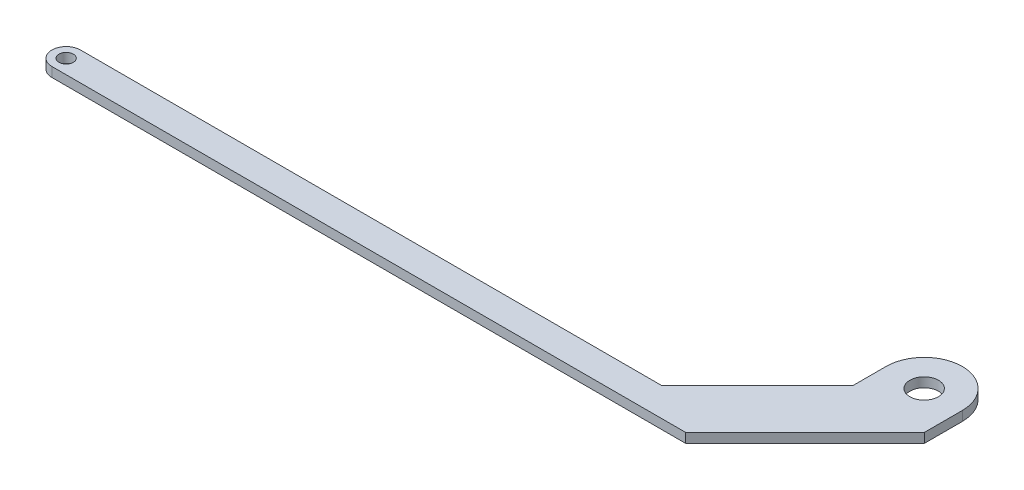
ISO-10303-21;
HEADER;
FILE_DESCRIPTION(('STEP AP214'),'2;1');
FILE_NAME('part.step','',(''),(''),'','','');
FILE_SCHEMA(('AUTOMOTIVE_DESIGN { 1 0 10303 214 1 1 1 1 }'));
ENDSEC;
DATA;
#1=APPLICATION_CONTEXT('core data for automotive mechanical design processes');
#2=APPLICATION_PROTOCOL_DEFINITION('international standard','automotive_design',2000,#1);
#3=PRODUCT_CONTEXT('',#1,'mechanical');
#4=PRODUCT('Part','Part','',(#3));
#5=PRODUCT_RELATED_PRODUCT_CATEGORY('part','',(#4));
#6=PRODUCT_DEFINITION_FORMATION('','',#4);
#7=PRODUCT_DEFINITION_CONTEXT('part definition',#1,'design');
#8=PRODUCT_DEFINITION('design','',#6,#7);
#9=PRODUCT_DEFINITION_SHAPE('','',#8);
#10=(LENGTH_UNIT() NAMED_UNIT(*) SI_UNIT(.MILLI.,.METRE.));
#11=(NAMED_UNIT(*) PLANE_ANGLE_UNIT() SI_UNIT($,.RADIAN.));
#12=(NAMED_UNIT(*) SI_UNIT($,.STERADIAN.) SOLID_ANGLE_UNIT());
#13=UNCERTAINTY_MEASURE_WITH_UNIT(LENGTH_MEASURE(1.E-05),#10,'distance_accuracy_value','');
#14=(GEOMETRIC_REPRESENTATION_CONTEXT(3) GLOBAL_UNCERTAINTY_ASSIGNED_CONTEXT((#13)) GLOBAL_UNIT_ASSIGNED_CONTEXT((#10,
#11,#12)) REPRESENTATION_CONTEXT('',''));
#15=CARTESIAN_POINT('',(0.,0.,0.));
#16=DIRECTION('',(0.,0.,1.));
#17=DIRECTION('',(1.,0.,0.));
#18=AXIS2_PLACEMENT_3D('',#15,#16,#17);
#19=CARTESIAN_POINT('',(0.,1.,0.));
#20=DIRECTION('',(0.,-1.,0.));
#21=DIRECTION('',(0.,0.,-1.));
#22=AXIS2_PLACEMENT_3D('',#19,#20,#21);
#23=PLANE('',#22);
#24=CARTESIAN_POINT('',(0.,1.,0.));
#25=DIRECTION('',(0.,1.,0.));
#26=DIRECTION('',(0.,0.,-1.));
#27=AXIS2_PLACEMENT_3D('',#24,#25,#26);
#28=CIRCLE('',#27,4.);
#29=CARTESIAN_POINT('',(4.,1.,0.));
#30=VERTEX_POINT('',#29);
#31=CARTESIAN_POINT('',(-4.,1.,0.));
#32=VERTEX_POINT('',#31);
#33=EDGE_CURVE('E151',#30,#32,#28,.T.);
#34=ORIENTED_EDGE('',*,*,#33,.T.);
#35=DIRECTION('',(0.,0.,1.));
#36=VECTOR('',#35,1.);
#37=CARTESIAN_POINT('',(-4.,1.,0.));
#38=LINE('',#37,#36);
#39=CARTESIAN_POINT('',(-4.,1.,3.50000000000002));
#40=VERTEX_POINT('',#39);
#41=EDGE_CURVE('E97',#32,#40,#38,.T.);
#42=ORIENTED_EDGE('',*,*,#41,.T.);
#43=DIRECTION('',(-0.707106781186547,0.,0.707106781186548));
#44=VECTOR('',#43,1.);
#45=CARTESIAN_POINT('',(-4.,1.,3.50000000000002));
#46=LINE('',#45,#44);
#47=CARTESIAN_POINT('',(-14.,1.,13.5));
#48=VERTEX_POINT('',#47);
#49=EDGE_CURVE('E167',#40,#48,#46,.T.);
#50=ORIENTED_EDGE('',*,*,#49,.T.);
#51=DIRECTION('',(-1.,0.,0.));
#52=VECTOR('',#51,1.);
#53=CARTESIAN_POINT('',(-14.,1.,13.5));
#54=LINE('',#53,#52);
#55=CARTESIAN_POINT('',(-75.,1.,13.5));
#56=VERTEX_POINT('',#55);
#57=EDGE_CURVE('E177',#48,#56,#54,.T.);
#58=ORIENTED_EDGE('',*,*,#57,.T.);
#59=CARTESIAN_POINT('',(-75.,1.,15.));
#60=DIRECTION('',(0.,1.,0.));
#61=DIRECTION('',(0.,0.,-1.));
#62=AXIS2_PLACEMENT_3D('',#59,#60,#61);
#63=CIRCLE('',#62,1.5);
#64=CARTESIAN_POINT('',(-75.,1.,16.5));
#65=VERTEX_POINT('',#64);
#66=EDGE_CURVE('E119',#56,#65,#63,.T.);
#67=ORIENTED_EDGE('',*,*,#66,.T.);
#68=DIRECTION('',(1.,0.,0.));
#69=VECTOR('',#68,1.);
#70=CARTESIAN_POINT('',(-8.51471862576142,1.,16.5));
#71=LINE('',#70,#69);
#72=CARTESIAN_POINT('',(-8.51471862576142,1.,16.5));
#73=VERTEX_POINT('',#72);
#74=EDGE_CURVE('E115',#65,#73,#71,.T.);
#75=ORIENTED_EDGE('',*,*,#74,.T.);
#76=DIRECTION('',(0.707106781186547,0.,-0.707106781186548));
#77=VECTOR('',#76,1.);
#78=CARTESIAN_POINT('',(4.,1.,3.98528137423859));
#79=LINE('',#78,#77);
#80=CARTESIAN_POINT('',(4.,1.,3.98528137423859));
#81=VERTEX_POINT('',#80);
#82=EDGE_CURVE('E117',#73,#81,#79,.T.);
#83=ORIENTED_EDGE('',*,*,#82,.T.);
#84=DIRECTION('',(0.,0.,-1.));
#85=VECTOR('',#84,1.);
#86=CARTESIAN_POINT('',(4.,1.,0.));
#87=LINE('',#86,#85);
#88=EDGE_CURVE('E57',#81,#30,#87,.T.);
#89=ORIENTED_EDGE('',*,*,#88,.T.);
#90=EDGE_LOOP('',(#34,#42,#50,#58,#67,#75,#83,#89));
#91=FACE_BOUND('',#90,.T.);
#92=CARTESIAN_POINT('',(0.,1.,0.));
#93=DIRECTION('',(0.,1.,0.));
#94=DIRECTION('',(0.,0.,1.));
#95=AXIS2_PLACEMENT_3D('',#92,#93,#94);
#96=CIRCLE('',#95,1.5);
#97=CARTESIAN_POINT('',(0.,1.,1.5));
#98=VERTEX_POINT('',#97);
#99=EDGE_CURVE('E139',#98,#98,#96,.T.);
#100=ORIENTED_EDGE('',*,*,#99,.F.);
#101=EDGE_LOOP('',(#100));
#102=FACE_BOUND('',#101,.T.);
#103=CARTESIAN_POINT('',(-75.,1.,15.));
#104=DIRECTION('',(0.,1.,0.));
#105=DIRECTION('',(0.,0.,1.));
#106=AXIS2_PLACEMENT_3D('',#103,#104,#105);
#107=CIRCLE('',#106,0.749999999999999);
#108=CARTESIAN_POINT('',(-75.,1.,15.75));
#109=VERTEX_POINT('',#108);
#110=EDGE_CURVE('E189',#109,#109,#107,.T.);
#111=ORIENTED_EDGE('',*,*,#110,.F.);
#112=EDGE_LOOP('',(#111));
#113=FACE_BOUND('',#112,.T.);
#114=ADVANCED_FACE('F39',(#91,#102,#113),#23,.F.);
#115=CARTESIAN_POINT('',(0.,0.,0.));
#116=DIRECTION('',(0.,-1.,0.));
#117=DIRECTION('',(0.,0.,-1.));
#118=AXIS2_PLACEMENT_3D('',#115,#116,#117);
#119=PLANE('',#118);
#120=CARTESIAN_POINT('',(0.,0.,0.));
#121=DIRECTION('',(0.,1.,0.));
#122=DIRECTION('',(0.,0.,1.));
#123=AXIS2_PLACEMENT_3D('',#120,#121,#122);
#124=CIRCLE('',#123,1.5);
#125=CARTESIAN_POINT('',(0.,0.,1.5));
#126=VERTEX_POINT('',#125);
#127=EDGE_CURVE('E183',#126,#126,#124,.T.);
#128=ORIENTED_EDGE('',*,*,#127,.T.);
#129=EDGE_LOOP('',(#128));
#130=FACE_BOUND('',#129,.T.);
#131=CARTESIAN_POINT('',(0.,0.,0.));
#132=DIRECTION('',(0.,1.,0.));
#133=DIRECTION('',(0.,0.,-1.));
#134=AXIS2_PLACEMENT_3D('',#131,#132,#133);
#135=CIRCLE('',#134,4.);
#136=CARTESIAN_POINT('',(4.,0.,0.));
#137=VERTEX_POINT('',#136);
#138=CARTESIAN_POINT('',(-4.,0.,0.));
#139=VERTEX_POINT('',#138);
#140=EDGE_CURVE('E136',#137,#139,#135,.T.);
#141=ORIENTED_EDGE('',*,*,#140,.F.);
#142=DIRECTION('',(0.,0.,-1.));
#143=VECTOR('',#142,1.);
#144=CARTESIAN_POINT('',(4.,0.,0.));
#145=LINE('',#144,#143);
#146=CARTESIAN_POINT('',(4.,0.,3.98528137423859));
#147=VERTEX_POINT('',#146);
#148=EDGE_CURVE('E93',#147,#137,#145,.T.);
#149=ORIENTED_EDGE('',*,*,#148,.F.);
#150=DIRECTION('',(0.707106781186547,0.,-0.707106781186548));
#151=VECTOR('',#150,1.);
#152=CARTESIAN_POINT('',(4.,0.,3.98528137423859));
#153=LINE('',#152,#151);
#154=CARTESIAN_POINT('',(-8.51471862576142,0.,16.5));
#155=VERTEX_POINT('',#154);
#156=EDGE_CURVE('E84',#155,#147,#153,.T.);
#157=ORIENTED_EDGE('',*,*,#156,.F.);
#158=DIRECTION('',(1.,0.,0.));
#159=VECTOR('',#158,1.);
#160=CARTESIAN_POINT('',(-8.51471862576142,0.,16.5));
#161=LINE('',#160,#159);
#162=CARTESIAN_POINT('',(-75.,0.,16.5));
#163=VERTEX_POINT('',#162);
#164=EDGE_CURVE('E127',#163,#155,#161,.T.);
#165=ORIENTED_EDGE('',*,*,#164,.F.);
#166=CARTESIAN_POINT('',(-75.,0.,15.));
#167=DIRECTION('',(0.,1.,0.));
#168=DIRECTION('',(0.,0.,-1.));
#169=AXIS2_PLACEMENT_3D('',#166,#167,#168);
#170=CIRCLE('',#169,1.5);
#171=CARTESIAN_POINT('',(-75.,0.,13.5));
#172=VERTEX_POINT('',#171);
#173=EDGE_CURVE('E148',#172,#163,#170,.T.);
#174=ORIENTED_EDGE('',*,*,#173,.F.);
#175=DIRECTION('',(-1.,0.,0.));
#176=VECTOR('',#175,1.);
#177=CARTESIAN_POINT('',(-14.,0.,13.5));
#178=LINE('',#177,#176);
#179=CARTESIAN_POINT('',(-14.,0.,13.5));
#180=VERTEX_POINT('',#179);
#181=EDGE_CURVE('E145',#180,#172,#178,.T.);
#182=ORIENTED_EDGE('',*,*,#181,.F.);
#183=DIRECTION('',(-0.707106781186547,0.,0.707106781186548));
#184=VECTOR('',#183,1.);
#185=CARTESIAN_POINT('',(-4.,0.,3.50000000000002));
#186=LINE('',#185,#184);
#187=CARTESIAN_POINT('',(-4.,0.,3.50000000000002));
#188=VERTEX_POINT('',#187);
#189=EDGE_CURVE('E142',#188,#180,#186,.T.);
#190=ORIENTED_EDGE('',*,*,#189,.F.);
#191=DIRECTION('',(0.,0.,1.));
#192=VECTOR('',#191,1.);
#193=CARTESIAN_POINT('',(-4.,0.,0.));
#194=LINE('',#193,#192);
#195=EDGE_CURVE('E137',#139,#188,#194,.T.);
#196=ORIENTED_EDGE('',*,*,#195,.F.);
#197=EDGE_LOOP('',(#141,#149,#157,#165,#174,#182,#190,#196));
#198=FACE_BOUND('',#197,.T.);
#199=CARTESIAN_POINT('',(-75.,0.,15.));
#200=DIRECTION('',(0.,1.,0.));
#201=DIRECTION('',(0.,0.,1.));
#202=AXIS2_PLACEMENT_3D('',#199,#200,#201);
#203=CIRCLE('',#202,0.749999999999999);
#204=CARTESIAN_POINT('',(-75.,0.,15.75));
#205=VERTEX_POINT('',#204);
#206=EDGE_CURVE('E191',#205,#205,#203,.T.);
#207=ORIENTED_EDGE('',*,*,#206,.T.);
#208=EDGE_LOOP('',(#207));
#209=FACE_BOUND('',#208,.T.);
#210=ADVANCED_FACE('F168',(#130,#198,#209),#119,.T.);
#211=CARTESIAN_POINT('',(0.,1.,0.));
#212=DIRECTION('',(0.,-1.,0.));
#213=DIRECTION('',(0.,0.,-1.));
#214=AXIS2_PLACEMENT_3D('',#211,#212,#213);
#215=CYLINDRICAL_SURFACE('',#214,4.);
#216=ORIENTED_EDGE('',*,*,#140,.T.);
#217=DIRECTION('',(0.,-1.,0.));
#218=VECTOR('',#217,1.);
#219=CARTESIAN_POINT('',(-4.,1.,0.));
#220=LINE('',#219,#218);
#221=EDGE_CURVE('E11',#32,#139,#220,.T.);
#222=ORIENTED_EDGE('',*,*,#221,.F.);
#223=ORIENTED_EDGE('',*,*,#33,.F.);
#224=DIRECTION('',(0.,-1.,0.));
#225=VECTOR('',#224,1.);
#226=CARTESIAN_POINT('',(4.,1.,0.));
#227=LINE('',#226,#225);
#228=EDGE_CURVE('E135',#30,#137,#227,.T.);
#229=ORIENTED_EDGE('',*,*,#228,.T.);
#230=EDGE_LOOP('',(#216,#222,#223,#229));
#231=FACE_BOUND('',#230,.T.);
#232=ADVANCED_FACE('F41',(#231),#215,.T.);
#233=CARTESIAN_POINT('',(-4.,1.,0.));
#234=DIRECTION('',(1.,0.,0.));
#235=DIRECTION('',(0.,0.,-1.));
#236=AXIS2_PLACEMENT_3D('',#233,#234,#235);
#237=PLANE('',#236);
#238=ORIENTED_EDGE('',*,*,#195,.T.);
#239=DIRECTION('',(0.,-1.,0.));
#240=VECTOR('',#239,1.);
#241=CARTESIAN_POINT('',(-4.,1.,3.50000000000002));
#242=LINE('',#241,#240);
#243=EDGE_CURVE('E48',#40,#188,#242,.T.);
#244=ORIENTED_EDGE('',*,*,#243,.F.);
#245=ORIENTED_EDGE('',*,*,#41,.F.);
#246=ORIENTED_EDGE('',*,*,#221,.T.);
#247=EDGE_LOOP('',(#238,#244,#245,#246));
#248=FACE_BOUND('',#247,.T.);
#249=ADVANCED_FACE('F224',(#248),#237,.F.);
#250=CARTESIAN_POINT('',(-4.,1.,3.50000000000002));
#251=DIRECTION('',(0.707106781186548,0.,0.707106781186547));
#252=DIRECTION('',(0.707106781186547,0.,-0.707106781186548));
#253=AXIS2_PLACEMENT_3D('',#250,#251,#252);
#254=PLANE('',#253);
#255=ORIENTED_EDGE('',*,*,#189,.T.);
#256=DIRECTION('',(0.,-1.,0.));
#257=VECTOR('',#256,1.);
#258=CARTESIAN_POINT('',(-14.,1.,13.5));
#259=LINE('',#258,#257);
#260=EDGE_CURVE('E158',#48,#180,#259,.T.);
#261=ORIENTED_EDGE('',*,*,#260,.F.);
#262=ORIENTED_EDGE('',*,*,#49,.F.);
#263=ORIENTED_EDGE('',*,*,#243,.T.);
#264=EDGE_LOOP('',(#255,#261,#262,#263));
#265=FACE_BOUND('',#264,.T.);
#266=ADVANCED_FACE('F163',(#265),#254,.F.);
#267=CARTESIAN_POINT('',(-14.,1.,13.5));
#268=DIRECTION('',(0.,0.,1.));
#269=DIRECTION('',(1.,0.,0.));
#270=AXIS2_PLACEMENT_3D('',#267,#268,#269);
#271=PLANE('',#270);
#272=ORIENTED_EDGE('',*,*,#181,.T.);
#273=DIRECTION('',(0.,-1.,0.));
#274=VECTOR('',#273,1.);
#275=CARTESIAN_POINT('',(-75.,1.,13.5));
#276=LINE('',#275,#274);
#277=EDGE_CURVE('E154',#56,#172,#276,.T.);
#278=ORIENTED_EDGE('',*,*,#277,.F.);
#279=ORIENTED_EDGE('',*,*,#57,.F.);
#280=ORIENTED_EDGE('',*,*,#260,.T.);
#281=EDGE_LOOP('',(#272,#278,#279,#280));
#282=FACE_BOUND('',#281,.T.);
#283=ADVANCED_FACE('F173',(#282),#271,.F.);
#284=CARTESIAN_POINT('',(-75.,1.,15.));
#285=DIRECTION('',(0.,-1.,0.));
#286=DIRECTION('',(0.,0.,-1.));
#287=AXIS2_PLACEMENT_3D('',#284,#285,#286);
#288=CYLINDRICAL_SURFACE('',#287,1.5);
#289=ORIENTED_EDGE('',*,*,#173,.T.);
#290=DIRECTION('',(0.,-1.,0.));
#291=VECTOR('',#290,1.);
#292=CARTESIAN_POINT('',(-75.,1.,16.5));
#293=LINE('',#292,#291);
#294=EDGE_CURVE('E130',#65,#163,#293,.T.);
#295=ORIENTED_EDGE('',*,*,#294,.F.);
#296=ORIENTED_EDGE('',*,*,#66,.F.);
#297=ORIENTED_EDGE('',*,*,#277,.T.);
#298=EDGE_LOOP('',(#289,#295,#296,#297));
#299=FACE_BOUND('',#298,.T.);
#300=ADVANCED_FACE('F178',(#299),#288,.T.);
#301=CARTESIAN_POINT('',(-8.51471862576142,1.,16.5));
#302=DIRECTION('',(0.,0.,-1.));
#303=DIRECTION('',(-1.,0.,0.));
#304=AXIS2_PLACEMENT_3D('',#301,#302,#303);
#305=PLANE('',#304);
#306=ORIENTED_EDGE('',*,*,#164,.T.);
#307=DIRECTION('',(0.,-1.,0.));
#308=VECTOR('',#307,1.);
#309=CARTESIAN_POINT('',(-8.51471862576142,1.,16.5));
#310=LINE('',#309,#308);
#311=EDGE_CURVE('E123',#73,#155,#310,.T.);
#312=ORIENTED_EDGE('',*,*,#311,.F.);
#313=ORIENTED_EDGE('',*,*,#74,.F.);
#314=ORIENTED_EDGE('',*,*,#294,.T.);
#315=EDGE_LOOP('',(#306,#312,#313,#314));
#316=FACE_BOUND('',#315,.T.);
#317=ADVANCED_FACE('F122',(#316),#305,.F.);
#318=CARTESIAN_POINT('',(4.,1.,3.98528137423859));
#319=DIRECTION('',(-0.707106781186548,0.,-0.707106781186547));
#320=DIRECTION('',(-0.707106781186547,0.,0.707106781186548));
#321=AXIS2_PLACEMENT_3D('',#318,#319,#320);
#322=PLANE('',#321);
#323=ORIENTED_EDGE('',*,*,#156,.T.);
#324=DIRECTION('',(0.,-1.,0.));
#325=VECTOR('',#324,1.);
#326=CARTESIAN_POINT('',(4.,1.,3.98528137423859));
#327=LINE('',#326,#325);
#328=EDGE_CURVE('E126',#81,#147,#327,.T.);
#329=ORIENTED_EDGE('',*,*,#328,.F.);
#330=ORIENTED_EDGE('',*,*,#82,.F.);
#331=ORIENTED_EDGE('',*,*,#311,.T.);
#332=EDGE_LOOP('',(#323,#329,#330,#331));
#333=FACE_BOUND('',#332,.T.);
#334=ADVANCED_FACE('F128',(#333),#322,.F.);
#335=CARTESIAN_POINT('',(4.,1.,0.));
#336=DIRECTION('',(-1.,0.,0.));
#337=DIRECTION('',(0.,0.,1.));
#338=AXIS2_PLACEMENT_3D('',#335,#336,#337);
#339=PLANE('',#338);
#340=ORIENTED_EDGE('',*,*,#148,.T.);
#341=ORIENTED_EDGE('',*,*,#228,.F.);
#342=ORIENTED_EDGE('',*,*,#88,.F.);
#343=ORIENTED_EDGE('',*,*,#328,.T.);
#344=EDGE_LOOP('',(#340,#341,#342,#343));
#345=FACE_BOUND('',#344,.T.);
#346=ADVANCED_FACE('F211',(#345),#339,.F.);
#347=CARTESIAN_POINT('',(0.,1.,0.));
#348=DIRECTION('',(0.,-1.,0.));
#349=DIRECTION('',(0.,0.,-1.));
#350=AXIS2_PLACEMENT_3D('',#347,#348,#349);
#351=CYLINDRICAL_SURFACE('',#350,1.5);
#352=ORIENTED_EDGE('',*,*,#99,.T.);
#353=EDGE_LOOP('',(#352));
#354=FACE_BOUND('',#353,.T.);
#355=ORIENTED_EDGE('',*,*,#127,.F.);
#356=EDGE_LOOP('',(#355));
#357=FACE_BOUND('',#356,.T.);
#358=ADVANCED_FACE('F208',(#354,#357),#351,.F.);
#359=CARTESIAN_POINT('',(-75.,1.,15.));
#360=DIRECTION('',(0.,-1.,0.));
#361=DIRECTION('',(0.,0.,-1.));
#362=AXIS2_PLACEMENT_3D('',#359,#360,#361);
#363=CYLINDRICAL_SURFACE('',#362,0.749999999999999);
#364=ORIENTED_EDGE('',*,*,#110,.T.);
#365=EDGE_LOOP('',(#364));
#366=FACE_BOUND('',#365,.T.);
#367=ORIENTED_EDGE('',*,*,#206,.F.);
#368=EDGE_LOOP('',(#367));
#369=FACE_BOUND('',#368,.T.);
#370=ADVANCED_FACE('F197',(#366,#369),#363,.F.);
#371=CLOSED_SHELL('',(#114,#210,#232,#249,#266,#283,#300,#317,#334,#346,#358,#370));
#372=MANIFOLD_SOLID_BREP('B2',#371);
#373=ADVANCED_BREP_SHAPE_REPRESENTATION('',(#18,#372),#14);
#374=SHAPE_DEFINITION_REPRESENTATION(#9,#373);
ENDSEC;
END-ISO-10303-21;
